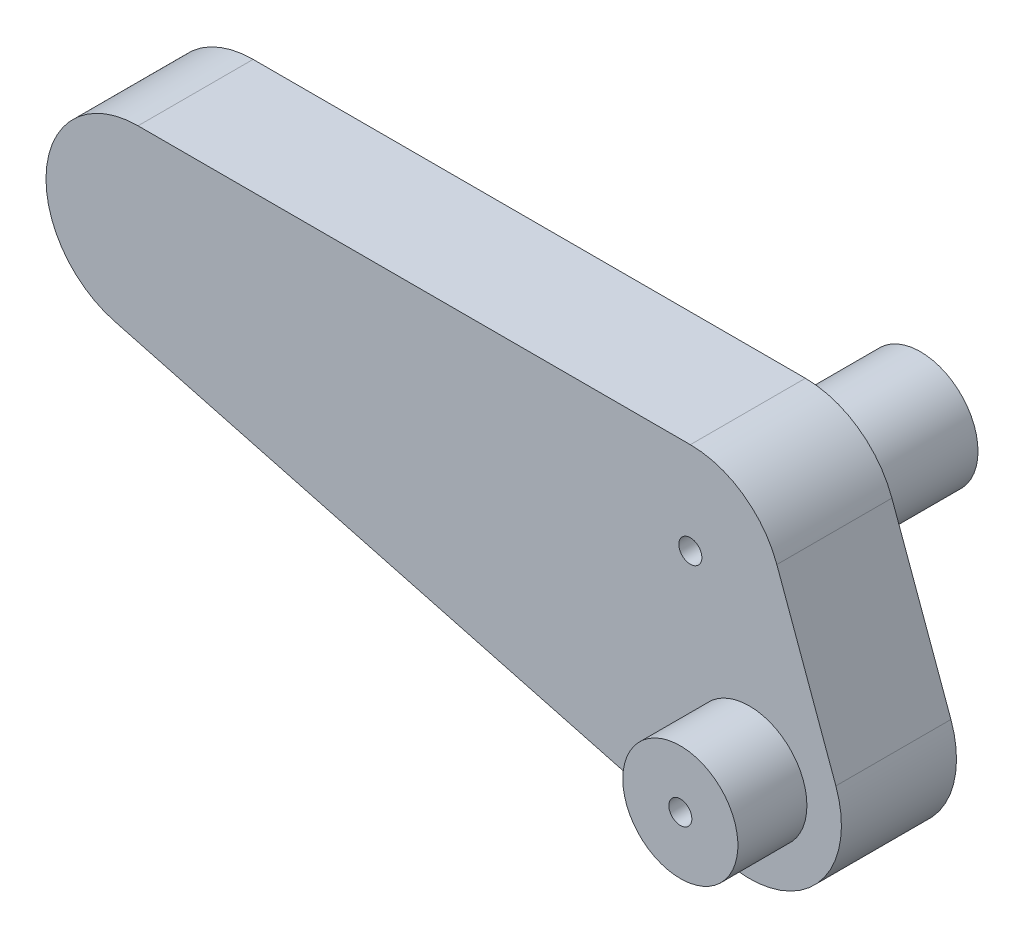
ISO-10303-21;
HEADER;
FILE_DESCRIPTION(('STEP AP214'),'2;1');
FILE_NAME('part.step','',(''),(''),'','','');
FILE_SCHEMA(('AUTOMOTIVE_DESIGN { 1 0 10303 214 1 1 1 1 }'));
ENDSEC;
DATA;
#1=APPLICATION_CONTEXT('core data for automotive mechanical design processes');
#2=APPLICATION_PROTOCOL_DEFINITION('international standard','automotive_design',2000,#1);
#3=PRODUCT_CONTEXT('',#1,'mechanical');
#4=PRODUCT('Part','Part','',(#3));
#5=PRODUCT_RELATED_PRODUCT_CATEGORY('part','',(#4));
#6=PRODUCT_DEFINITION_FORMATION('','',#4);
#7=PRODUCT_DEFINITION_CONTEXT('part definition',#1,'design');
#8=PRODUCT_DEFINITION('design','',#6,#7);
#9=PRODUCT_DEFINITION_SHAPE('','',#8);
#10=(LENGTH_UNIT() NAMED_UNIT(*) SI_UNIT(.MILLI.,.METRE.));
#11=(NAMED_UNIT(*) PLANE_ANGLE_UNIT() SI_UNIT($,.RADIAN.));
#12=(NAMED_UNIT(*) SI_UNIT($,.STERADIAN.) SOLID_ANGLE_UNIT());
#13=UNCERTAINTY_MEASURE_WITH_UNIT(LENGTH_MEASURE(1.E-05),#10,'distance_accuracy_value','');
#14=(GEOMETRIC_REPRESENTATION_CONTEXT(3) GLOBAL_UNCERTAINTY_ASSIGNED_CONTEXT((#13)) GLOBAL_UNIT_ASSIGNED_CONTEXT((#10,
#11,#12)) REPRESENTATION_CONTEXT('',''));
#15=CARTESIAN_POINT('',(0.,0.,0.));
#16=DIRECTION('',(0.,0.,1.));
#17=DIRECTION('',(1.,0.,0.));
#18=AXIS2_PLACEMENT_3D('',#15,#16,#17);
#19=CARTESIAN_POINT('',(0.,0.,5.));
#20=DIRECTION('',(0.,0.,1.));
#21=DIRECTION('',(1.,0.,0.));
#22=AXIS2_PLACEMENT_3D('',#19,#20,#21);
#23=PLANE('',#22);
#24=CARTESIAN_POINT('',(0.,0.,5.));
#25=DIRECTION('',(0.,0.,1.));
#26=DIRECTION('',(1.,0.,0.));
#27=AXIS2_PLACEMENT_3D('',#24,#25,#26);
#28=CIRCLE('',#27,4.);
#29=CARTESIAN_POINT('',(3.75877048314363,1.36808057330269,5.));
#30=VERTEX_POINT('',#29);
#31=CARTESIAN_POINT('',(0.,4.,5.));
#32=VERTEX_POINT('',#31);
#33=EDGE_CURVE('E130',#30,#32,#28,.T.);
#34=ORIENTED_EDGE('',*,*,#33,.T.);
#35=DIRECTION('',(-1.,0.,0.));
#36=VECTOR('',#35,1.);
#37=CARTESIAN_POINT('',(-24.,4.,5.));
#38=LINE('',#37,#36);
#39=CARTESIAN_POINT('',(-24.,4.,5.));
#40=VERTEX_POINT('',#39);
#41=EDGE_CURVE('E88',#32,#40,#38,.T.);
#42=ORIENTED_EDGE('',*,*,#41,.T.);
#43=CARTESIAN_POINT('',(-24.,0.,5.));
#44=DIRECTION('',(0.,0.,1.));
#45=DIRECTION('',(1.,0.,0.));
#46=AXIS2_PLACEMENT_3D('',#43,#44,#45);
#47=CIRCLE('',#46,4.);
#48=CARTESIAN_POINT('',(-25.0257112532735,-3.86625353862212,5.));
#49=VERTEX_POINT('',#48);
#50=EDGE_CURVE('E101',#40,#49,#47,.T.);
#51=ORIENTED_EDGE('',*,*,#50,.T.);
#52=DIRECTION('',(0.96656338465553,-0.256427813318378,0.));
#53=VECTOR('',#52,1.);
#54=CARTESIAN_POINT('',(1.53943982166903,-10.9139481945164,5.));
#55=LINE('',#54,#53);
#56=CARTESIAN_POINT('',(1.53943982166903,-10.9139481945164,5.));
#57=VERTEX_POINT('',#56);
#58=EDGE_CURVE('E95',#49,#57,#55,.T.);
#59=ORIENTED_EDGE('',*,*,#58,.T.);
#60=CARTESIAN_POINT('',(2.56515107494255,-7.0476946558943,5.));
#61=DIRECTION('',(0.,0.,1.));
#62=DIRECTION('',(1.,0.,0.));
#63=AXIS2_PLACEMENT_3D('',#60,#61,#62);
#64=CIRCLE('',#63,4.);
#65=CARTESIAN_POINT('',(6.32392155808617,-5.67961408259161,5.));
#66=VERTEX_POINT('',#65);
#67=EDGE_CURVE('E99',#57,#66,#64,.T.);
#68=ORIENTED_EDGE('',*,*,#67,.T.);
#69=DIRECTION('',(-0.342020143325673,0.939692620785907,0.));
#70=VECTOR('',#69,1.);
#71=CARTESIAN_POINT('',(3.75877048314363,1.36808057330269,5.));
#72=LINE('',#71,#70);
#73=EDGE_CURVE('E51',#66,#30,#72,.T.);
#74=ORIENTED_EDGE('',*,*,#73,.T.);
#75=EDGE_LOOP('',(#34,#42,#51,#59,#68,#74));
#76=FACE_BOUND('',#75,.T.);
#77=CARTESIAN_POINT('',(2.56515107494255,-7.0476946558943,5.));
#78=DIRECTION('',(0.,0.,1.));
#79=DIRECTION('',(1.,0.,0.));
#80=AXIS2_PLACEMENT_3D('',#77,#78,#79);
#81=CIRCLE('',#80,2.5);
#82=CARTESIAN_POINT('',(5.06515107494255,-7.0476946558943,5.));
#83=VERTEX_POINT('',#82);
#84=EDGE_CURVE('E123',#83,#83,#81,.T.);
#85=ORIENTED_EDGE('',*,*,#84,.F.);
#86=EDGE_LOOP('',(#85));
#87=FACE_BOUND('',#86,.T.);
#88=CARTESIAN_POINT('',(0.,0.,5.));
#89=DIRECTION('',(0.,0.,1.));
#90=DIRECTION('',(1.,0.,0.));
#91=AXIS2_PLACEMENT_3D('',#88,#89,#90);
#92=CIRCLE('',#91,0.5);
#93=CARTESIAN_POINT('',(0.5,0.,5.));
#94=VERTEX_POINT('',#93);
#95=EDGE_CURVE('E197',#94,#94,#92,.T.);
#96=ORIENTED_EDGE('',*,*,#95,.F.);
#97=EDGE_LOOP('',(#96));
#98=FACE_BOUND('',#97,.T.);
#99=ADVANCED_FACE('F34',(#76,#87,#98),#23,.T.);
#100=CARTESIAN_POINT('',(0.,0.,0.));
#101=DIRECTION('',(0.,0.,1.));
#102=DIRECTION('',(1.,0.,0.));
#103=AXIS2_PLACEMENT_3D('',#100,#101,#102);
#104=PLANE('',#103);
#105=CARTESIAN_POINT('',(0.,0.,0.));
#106=DIRECTION('',(0.,0.,1.));
#107=DIRECTION('',(1.,0.,0.));
#108=AXIS2_PLACEMENT_3D('',#105,#106,#107);
#109=CIRCLE('',#108,4.);
#110=CARTESIAN_POINT('',(3.75877048314363,1.36808057330269,0.));
#111=VERTEX_POINT('',#110);
#112=CARTESIAN_POINT('',(0.,4.,0.));
#113=VERTEX_POINT('',#112);
#114=EDGE_CURVE('E119',#111,#113,#109,.T.);
#115=ORIENTED_EDGE('',*,*,#114,.F.);
#116=DIRECTION('',(-0.342020143325673,0.939692620785907,0.));
#117=VECTOR('',#116,1.);
#118=CARTESIAN_POINT('',(3.75877048314363,1.36808057330269,0.));
#119=LINE('',#118,#117);
#120=CARTESIAN_POINT('',(6.32392155808617,-5.67961408259161,0.));
#121=VERTEX_POINT('',#120);
#122=EDGE_CURVE('E80',#121,#111,#119,.T.);
#123=ORIENTED_EDGE('',*,*,#122,.F.);
#124=CARTESIAN_POINT('',(2.56515107494255,-7.0476946558943,0.));
#125=DIRECTION('',(0.,0.,1.));
#126=DIRECTION('',(1.,0.,0.));
#127=AXIS2_PLACEMENT_3D('',#124,#125,#126);
#128=CIRCLE('',#127,4.);
#129=CARTESIAN_POINT('',(1.53943982166903,-10.9139481945164,0.));
#130=VERTEX_POINT('',#129);
#131=EDGE_CURVE('E74',#130,#121,#128,.T.);
#132=ORIENTED_EDGE('',*,*,#131,.F.);
#133=DIRECTION('',(0.96656338465553,-0.256427813318378,0.));
#134=VECTOR('',#133,1.);
#135=CARTESIAN_POINT('',(1.53943982166903,-10.9139481945164,0.));
#136=LINE('',#135,#134);
#137=CARTESIAN_POINT('',(-25.0257112532735,-3.86625353862212,0.));
#138=VERTEX_POINT('',#137);
#139=EDGE_CURVE('E109',#138,#130,#136,.T.);
#140=ORIENTED_EDGE('',*,*,#139,.F.);
#141=CARTESIAN_POINT('',(-24.,0.,0.));
#142=DIRECTION('',(0.,0.,1.));
#143=DIRECTION('',(1.,0.,0.));
#144=AXIS2_PLACEMENT_3D('',#141,#142,#143);
#145=CIRCLE('',#144,4.);
#146=CARTESIAN_POINT('',(-24.,4.,0.));
#147=VERTEX_POINT('',#146);
#148=EDGE_CURVE('E125',#147,#138,#145,.T.);
#149=ORIENTED_EDGE('',*,*,#148,.F.);
#150=DIRECTION('',(-1.,0.,0.));
#151=VECTOR('',#150,1.);
#152=CARTESIAN_POINT('',(-24.,4.,0.));
#153=LINE('',#152,#151);
#154=EDGE_CURVE('E122',#113,#147,#153,.T.);
#155=ORIENTED_EDGE('',*,*,#154,.F.);
#156=EDGE_LOOP('',(#115,#123,#132,#140,#149,#155));
#157=FACE_BOUND('',#156,.T.);
#158=CARTESIAN_POINT('',(0.,0.,0.));
#159=DIRECTION('',(0.,0.,1.));
#160=DIRECTION('',(1.,0.,0.));
#161=AXIS2_PLACEMENT_3D('',#158,#159,#160);
#162=CIRCLE('',#161,2.5);
#163=CARTESIAN_POINT('',(2.5,0.,0.));
#164=VERTEX_POINT('',#163);
#165=EDGE_CURVE('E206',#164,#164,#162,.T.);
#166=ORIENTED_EDGE('',*,*,#165,.T.);
#167=EDGE_LOOP('',(#166));
#168=FACE_BOUND('',#167,.T.);
#169=CARTESIAN_POINT('',(2.56515107494255,-7.0476946558943,0.));
#170=DIRECTION('',(0.,0.,-1.));
#171=DIRECTION('',(-1.,0.,0.));
#172=AXIS2_PLACEMENT_3D('',#169,#170,#171);
#173=CIRCLE('',#172,0.5);
#174=CARTESIAN_POINT('',(2.06515107494255,-7.0476946558943,0.));
#175=VERTEX_POINT('',#174);
#176=EDGE_CURVE('E189',#175,#175,#173,.T.);
#177=ORIENTED_EDGE('',*,*,#176,.F.);
#178=EDGE_LOOP('',(#177));
#179=FACE_BOUND('',#178,.T.);
#180=ADVANCED_FACE('F139',(#157,#168,#179),#104,.F.);
#181=CARTESIAN_POINT('',(0.,0.,5.));
#182=DIRECTION('',(0.,0.,-1.));
#183=DIRECTION('',(-1.,0.,0.));
#184=AXIS2_PLACEMENT_3D('',#181,#182,#183);
#185=CYLINDRICAL_SURFACE('',#184,4.);
#186=ORIENTED_EDGE('',*,*,#114,.T.);
#187=DIRECTION('',(0.,0.,-1.));
#188=VECTOR('',#187,1.);
#189=CARTESIAN_POINT('',(0.,4.,5.));
#190=LINE('',#189,#188);
#191=EDGE_CURVE('E11',#32,#113,#190,.T.);
#192=ORIENTED_EDGE('',*,*,#191,.F.);
#193=ORIENTED_EDGE('',*,*,#33,.F.);
#194=DIRECTION('',(0.,0.,-1.));
#195=VECTOR('',#194,1.);
#196=CARTESIAN_POINT('',(3.75877048314363,1.36808057330269,5.));
#197=LINE('',#196,#195);
#198=EDGE_CURVE('E115',#30,#111,#197,.T.);
#199=ORIENTED_EDGE('',*,*,#198,.T.);
#200=EDGE_LOOP('',(#186,#192,#193,#199));
#201=FACE_BOUND('',#200,.T.);
#202=ADVANCED_FACE('F36',(#201),#185,.T.);
#203=CARTESIAN_POINT('',(-24.,4.,5.));
#204=DIRECTION('',(0.,-1.,0.));
#205=DIRECTION('',(1.,0.,0.));
#206=AXIS2_PLACEMENT_3D('',#203,#204,#205);
#207=PLANE('',#206);
#208=ORIENTED_EDGE('',*,*,#154,.T.);
#209=DIRECTION('',(0.,0.,-1.));
#210=VECTOR('',#209,1.);
#211=CARTESIAN_POINT('',(-24.,4.,5.));
#212=LINE('',#211,#210);
#213=EDGE_CURVE('E43',#40,#147,#212,.T.);
#214=ORIENTED_EDGE('',*,*,#213,.F.);
#215=ORIENTED_EDGE('',*,*,#41,.F.);
#216=ORIENTED_EDGE('',*,*,#191,.T.);
#217=EDGE_LOOP('',(#208,#214,#215,#216));
#218=FACE_BOUND('',#217,.T.);
#219=ADVANCED_FACE('F272',(#218),#207,.F.);
#220=CARTESIAN_POINT('',(-24.,0.,5.));
#221=DIRECTION('',(0.,0.,-1.));
#222=DIRECTION('',(-1.,0.,0.));
#223=AXIS2_PLACEMENT_3D('',#220,#221,#222);
#224=CYLINDRICAL_SURFACE('',#223,4.);
#225=ORIENTED_EDGE('',*,*,#148,.T.);
#226=DIRECTION('',(0.,0.,-1.));
#227=VECTOR('',#226,1.);
#228=CARTESIAN_POINT('',(-25.0257112532735,-3.86625353862212,5.));
#229=LINE('',#228,#227);
#230=EDGE_CURVE('E110',#49,#138,#229,.T.);
#231=ORIENTED_EDGE('',*,*,#230,.F.);
#232=ORIENTED_EDGE('',*,*,#50,.F.);
#233=ORIENTED_EDGE('',*,*,#213,.T.);
#234=EDGE_LOOP('',(#225,#231,#232,#233));
#235=FACE_BOUND('',#234,.T.);
#236=ADVANCED_FACE('F136',(#235),#224,.T.);
#237=CARTESIAN_POINT('',(1.53943982166903,-10.9139481945164,5.));
#238=DIRECTION('',(0.256427813318378,0.96656338465553,0.));
#239=DIRECTION('',(-0.96656338465553,0.256427813318378,0.));
#240=AXIS2_PLACEMENT_3D('',#237,#238,#239);
#241=PLANE('',#240);
#242=ORIENTED_EDGE('',*,*,#139,.T.);
#243=DIRECTION('',(0.,0.,-1.));
#244=VECTOR('',#243,1.);
#245=CARTESIAN_POINT('',(1.53943982166903,-10.9139481945164,5.));
#246=LINE('',#245,#244);
#247=EDGE_CURVE('E106',#57,#130,#246,.T.);
#248=ORIENTED_EDGE('',*,*,#247,.F.);
#249=ORIENTED_EDGE('',*,*,#58,.F.);
#250=ORIENTED_EDGE('',*,*,#230,.T.);
#251=EDGE_LOOP('',(#242,#248,#249,#250));
#252=FACE_BOUND('',#251,.T.);
#253=ADVANCED_FACE('F107',(#252),#241,.F.);
#254=CARTESIAN_POINT('',(2.56515107494255,-7.0476946558943,5.));
#255=DIRECTION('',(0.,0.,-1.));
#256=DIRECTION('',(-1.,0.,0.));
#257=AXIS2_PLACEMENT_3D('',#254,#255,#256);
#258=CYLINDRICAL_SURFACE('',#257,4.);
#259=ORIENTED_EDGE('',*,*,#131,.T.);
#260=DIRECTION('',(0.,0.,-1.));
#261=VECTOR('',#260,1.);
#262=CARTESIAN_POINT('',(6.32392155808617,-5.67961408259161,5.));
#263=LINE('',#262,#261);
#264=EDGE_CURVE('E111',#66,#121,#263,.T.);
#265=ORIENTED_EDGE('',*,*,#264,.F.);
#266=ORIENTED_EDGE('',*,*,#67,.F.);
#267=ORIENTED_EDGE('',*,*,#247,.T.);
#268=EDGE_LOOP('',(#259,#265,#266,#267));
#269=FACE_BOUND('',#268,.T.);
#270=ADVANCED_FACE('F113',(#269),#258,.T.);
#271=CARTESIAN_POINT('',(3.75877048314363,1.36808057330269,5.));
#272=DIRECTION('',(-0.939692620785907,-0.342020143325673,0.));
#273=DIRECTION('',(0.342020143325673,-0.939692620785907,0.));
#274=AXIS2_PLACEMENT_3D('',#271,#272,#273);
#275=PLANE('',#274);
#276=ORIENTED_EDGE('',*,*,#122,.T.);
#277=ORIENTED_EDGE('',*,*,#198,.F.);
#278=ORIENTED_EDGE('',*,*,#73,.F.);
#279=ORIENTED_EDGE('',*,*,#264,.T.);
#280=EDGE_LOOP('',(#276,#277,#278,#279));
#281=FACE_BOUND('',#280,.T.);
#282=ADVANCED_FACE('F144',(#281),#275,.F.);
#283=CARTESIAN_POINT('',(0.,0.,-5.));
#284=DIRECTION('',(0.,0.,1.));
#285=DIRECTION('',(1.,0.,0.));
#286=AXIS2_PLACEMENT_3D('',#283,#284,#285);
#287=CYLINDRICAL_SURFACE('',#286,2.5);
#288=CARTESIAN_POINT('',(0.,0.,-5.));
#289=DIRECTION('',(0.,0.,1.));
#290=DIRECTION('',(1.,0.,0.));
#291=AXIS2_PLACEMENT_3D('',#288,#289,#290);
#292=CIRCLE('',#291,2.5);
#293=CARTESIAN_POINT('',(2.5,0.,-5.));
#294=VERTEX_POINT('',#293);
#295=EDGE_CURVE('E201',#294,#294,#292,.T.);
#296=ORIENTED_EDGE('',*,*,#295,.T.);
#297=EDGE_LOOP('',(#296));
#298=FACE_BOUND('',#297,.T.);
#299=ORIENTED_EDGE('',*,*,#165,.F.);
#300=EDGE_LOOP('',(#299));
#301=FACE_BOUND('',#300,.T.);
#302=ADVANCED_FACE('F146',(#298,#301),#287,.T.);
#303=CARTESIAN_POINT('',(0.,0.,-5.));
#304=DIRECTION('',(0.,0.,1.));
#305=DIRECTION('',(1.,0.,0.));
#306=AXIS2_PLACEMENT_3D('',#303,#304,#305);
#307=PLANE('',#306);
#308=CARTESIAN_POINT('',(0.,0.,-5.));
#309=DIRECTION('',(0.,0.,1.));
#310=DIRECTION('',(1.,0.,0.));
#311=AXIS2_PLACEMENT_3D('',#308,#309,#310);
#312=CIRCLE('',#311,0.5);
#313=CARTESIAN_POINT('',(0.5,0.,-5.));
#314=VERTEX_POINT('',#313);
#315=EDGE_CURVE('E198',#314,#314,#312,.T.);
#316=ORIENTED_EDGE('',*,*,#315,.T.);
#317=EDGE_LOOP('',(#316));
#318=FACE_BOUND('',#317,.T.);
#319=ORIENTED_EDGE('',*,*,#295,.F.);
#320=EDGE_LOOP('',(#319));
#321=FACE_BOUND('',#320,.T.);
#322=ADVANCED_FACE('F152',(#318,#321),#307,.F.);
#323=CARTESIAN_POINT('',(0.,0.,-5.));
#324=DIRECTION('',(0.,0.,1.));
#325=DIRECTION('',(1.,0.,0.));
#326=AXIS2_PLACEMENT_3D('',#323,#324,#325);
#327=CYLINDRICAL_SURFACE('',#326,0.5);
#328=ORIENTED_EDGE('',*,*,#315,.F.);
#329=EDGE_LOOP('',(#328));
#330=FACE_BOUND('',#329,.T.);
#331=ORIENTED_EDGE('',*,*,#95,.T.);
#332=EDGE_LOOP('',(#331));
#333=FACE_BOUND('',#332,.T.);
#334=ADVANCED_FACE('F165',(#330,#333),#327,.F.);
#335=CARTESIAN_POINT('',(2.56515107494255,-7.0476946558943,8.));
#336=DIRECTION('',(0.,0.,-1.));
#337=DIRECTION('',(-1.,0.,0.));
#338=AXIS2_PLACEMENT_3D('',#335,#336,#337);
#339=CYLINDRICAL_SURFACE('',#338,2.5);
#340=ORIENTED_EDGE('',*,*,#84,.T.);
#341=EDGE_LOOP('',(#340));
#342=FACE_BOUND('',#341,.T.);
#343=CARTESIAN_POINT('',(2.56515107494255,-7.0476946558943,8.));
#344=DIRECTION('',(0.,0.,-1.));
#345=DIRECTION('',(-1.,0.,0.));
#346=AXIS2_PLACEMENT_3D('',#343,#344,#345);
#347=CIRCLE('',#346,2.5);
#348=CARTESIAN_POINT('',(0.0651510749425455,-7.0476946558943,8.));
#349=VERTEX_POINT('',#348);
#350=EDGE_CURVE('E192',#349,#349,#347,.T.);
#351=ORIENTED_EDGE('',*,*,#350,.T.);
#352=EDGE_LOOP('',(#351));
#353=FACE_BOUND('',#352,.T.);
#354=ADVANCED_FACE('F169',(#342,#353),#339,.T.);
#355=CARTESIAN_POINT('',(2.56515107494255,-7.0476946558943,8.));
#356=DIRECTION('',(0.,0.,-1.));
#357=DIRECTION('',(-1.,0.,0.));
#358=AXIS2_PLACEMENT_3D('',#355,#356,#357);
#359=PLANE('',#358);
#360=CARTESIAN_POINT('',(2.56515107494255,-7.0476946558943,8.));
#361=DIRECTION('',(0.,0.,-1.));
#362=DIRECTION('',(-1.,0.,0.));
#363=AXIS2_PLACEMENT_3D('',#360,#361,#362);
#364=CIRCLE('',#363,0.5);
#365=CARTESIAN_POINT('',(2.06515107494255,-7.0476946558943,8.));
#366=VERTEX_POINT('',#365);
#367=EDGE_CURVE('E186',#366,#366,#364,.T.);
#368=ORIENTED_EDGE('',*,*,#367,.T.);
#369=EDGE_LOOP('',(#368));
#370=FACE_BOUND('',#369,.T.);
#371=ORIENTED_EDGE('',*,*,#350,.F.);
#372=EDGE_LOOP('',(#371));
#373=FACE_BOUND('',#372,.T.);
#374=ADVANCED_FACE('F173',(#370,#373),#359,.F.);
#375=CARTESIAN_POINT('',(2.56515107494255,-7.0476946558943,8.));
#376=DIRECTION('',(0.,0.,-1.));
#377=DIRECTION('',(-1.,0.,0.));
#378=AXIS2_PLACEMENT_3D('',#375,#376,#377);
#379=CYLINDRICAL_SURFACE('',#378,0.5);
#380=ORIENTED_EDGE('',*,*,#367,.F.);
#381=EDGE_LOOP('',(#380));
#382=FACE_BOUND('',#381,.T.);
#383=ORIENTED_EDGE('',*,*,#176,.T.);
#384=EDGE_LOOP('',(#383));
#385=FACE_BOUND('',#384,.T.);
#386=ADVANCED_FACE('F177',(#382,#385),#379,.F.);
#387=CLOSED_SHELL('',(#99,#180,#202,#219,#236,#253,#270,#282,#302,#322,#334,#354,#374,#386));
#388=MANIFOLD_SOLID_BREP('B2',#387);
#389=ADVANCED_BREP_SHAPE_REPRESENTATION('',(#18,#388),#14);
#390=SHAPE_DEFINITION_REPRESENTATION(#9,#389);
ENDSEC;
END-ISO-10303-21;
